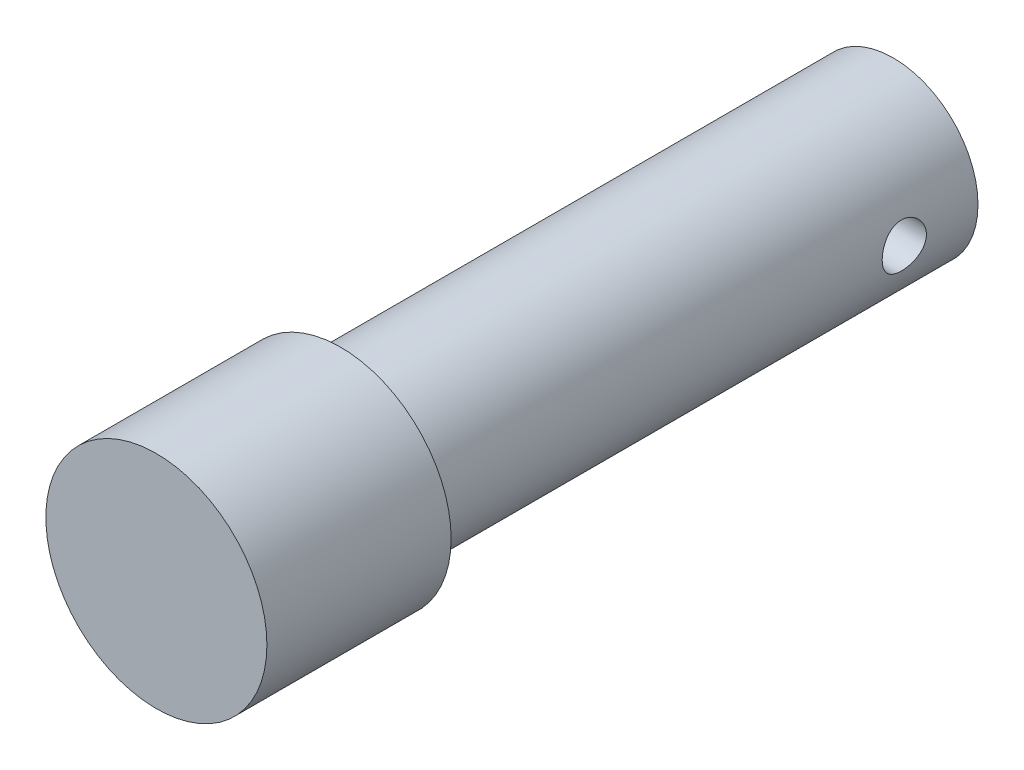
ISO-10303-21;
HEADER;
FILE_DESCRIPTION(('STEP AP214'),'2;1');
FILE_NAME('part.step','',(''),(''),'','','');
FILE_SCHEMA(('AUTOMOTIVE_DESIGN { 1 0 10303 214 1 1 1 1 }'));
ENDSEC;
DATA;
#1=APPLICATION_CONTEXT('core data for automotive mechanical design processes');
#2=APPLICATION_PROTOCOL_DEFINITION('international standard','automotive_design',2000,#1);
#3=PRODUCT_CONTEXT('',#1,'mechanical');
#4=PRODUCT('Part','Part','',(#3));
#5=PRODUCT_RELATED_PRODUCT_CATEGORY('part','',(#4));
#6=PRODUCT_DEFINITION_FORMATION('','',#4);
#7=PRODUCT_DEFINITION_CONTEXT('part definition',#1,'design');
#8=PRODUCT_DEFINITION('design','',#6,#7);
#9=PRODUCT_DEFINITION_SHAPE('','',#8);
#10=(LENGTH_UNIT() NAMED_UNIT(*) SI_UNIT(.MILLI.,.METRE.));
#11=(NAMED_UNIT(*) PLANE_ANGLE_UNIT() SI_UNIT($,.RADIAN.));
#12=(NAMED_UNIT(*) SI_UNIT($,.STERADIAN.) SOLID_ANGLE_UNIT());
#13=UNCERTAINTY_MEASURE_WITH_UNIT(LENGTH_MEASURE(1.E-05),#10,'distance_accuracy_value','');
#14=(GEOMETRIC_REPRESENTATION_CONTEXT(3) GLOBAL_UNCERTAINTY_ASSIGNED_CONTEXT((#13)) GLOBAL_UNIT_ASSIGNED_CONTEXT((#10,
#11,#12)) REPRESENTATION_CONTEXT('',''));
#15=CARTESIAN_POINT('',(0.,0.,0.));
#16=DIRECTION('',(0.,0.,1.));
#17=DIRECTION('',(1.,0.,0.));
#18=AXIS2_PLACEMENT_3D('',#15,#16,#17);
#19=CARTESIAN_POINT('',(0.,0.,20.));
#20=DIRECTION('',(0.,0.,-1.));
#21=DIRECTION('',(-1.,0.,0.));
#22=AXIS2_PLACEMENT_3D('',#19,#20,#21);
#23=CYLINDRICAL_SURFACE('',#22,2.3);
#24=CARTESIAN_POINT('',(0.,0.,0.));
#25=DIRECTION('',(0.,0.,1.));
#26=DIRECTION('',(1.,0.,0.));
#27=AXIS2_PLACEMENT_3D('',#24,#25,#26);
#28=CIRCLE('',#27,2.3);
#29=CARTESIAN_POINT('',(2.3,0.,0.));
#30=VERTEX_POINT('',#29);
#31=EDGE_CURVE('E49',#30,#30,#28,.T.);
#32=ORIENTED_EDGE('',*,*,#31,.T.);
#33=EDGE_LOOP('',(#32));
#34=FACE_BOUND('',#33,.T.);
#35=CARTESIAN_POINT('',(0.,0.,15.));
#36=DIRECTION('',(0.,0.,1.));
#37=DIRECTION('',(1.,0.,0.));
#38=AXIS2_PLACEMENT_3D('',#35,#36,#37);
#39=CIRCLE('',#38,2.3);
#40=CARTESIAN_POINT('',(2.3,0.,15.));
#41=VERTEX_POINT('',#40);
#42=EDGE_CURVE('E10',#41,#41,#39,.T.);
#43=ORIENTED_EDGE('',*,*,#42,.F.);
#44=EDGE_LOOP('',(#43));
#45=FACE_BOUND('',#44,.T.);
#46=CARTESIAN_POINT('',(2.3,0.,2.6));
#47=CARTESIAN_POINT('',(2.29999947684165,-0.0331026201720601,2.59999916122626));
#48=CARTESIAN_POINT('',(2.29927829471571,-0.066214358533514,2.59725134537636));
#49=CARTESIAN_POINT('',(2.2964713380731,-0.131485704025533,2.58635107363675));
#50=CARTESIAN_POINT('',(2.29438486559341,-0.163644815360249,2.57819585334815));
#51=CARTESIAN_POINT('',(2.28907788721465,-0.226059166658215,2.55676265163744));
#52=CARTESIAN_POINT('',(2.28585880855801,-0.256316746519614,2.54349111548509));
#53=CARTESIAN_POINT('',(2.27862774791672,-0.314176440073206,2.51222547721423));
#54=CARTESIAN_POINT('',(2.2746157222172,-0.341778407237713,2.49423111471018));
#55=CARTESIAN_POINT('',(2.26613286933225,-0.39415809747041,2.45360742121448));
#56=CARTESIAN_POINT('',(2.26165446733598,-0.418868247566317,2.43089254145927));
#57=CARTESIAN_POINT('',(2.25279283584502,-0.46417509639839,2.38165558187005));
#58=CARTESIAN_POINT('',(2.24840961811166,-0.484771289346703,2.35513303459287));
#59=CARTESIAN_POINT('',(2.24015755667313,-0.521590896798203,2.29849946095544));
#60=CARTESIAN_POINT('',(2.23629829132483,-0.537737336567531,2.26833686706777));
#61=CARTESIAN_POINT('',(2.22964214928102,-0.564703583563824,2.20560829622142));
#62=CARTESIAN_POINT('',(2.22684508603313,-0.575524326231022,2.17304274249066));
#63=CARTESIAN_POINT('',(2.22270812406389,-0.591298811010342,2.10717916922616));
#64=CARTESIAN_POINT('',(2.22133793709545,-0.596374710584678,2.07391235471923));
#65=CARTESIAN_POINT('',(2.22011931222218,-0.600896147949937,2.00697331429409));
#66=CARTESIAN_POINT('',(2.22027060314634,-0.600342689053825,1.97330116168723));
#67=CARTESIAN_POINT('',(2.22205069020862,-0.593718271860884,1.90745458044621));
#68=CARTESIAN_POINT('',(2.22364011723389,-0.587794322889984,1.87526412962448));
#69=CARTESIAN_POINT('',(2.2280544558132,-0.570832204709706,1.81235058009942));
#70=CARTESIAN_POINT('',(2.23087946231683,-0.559793642457791,1.78162759436651));
#71=CARTESIAN_POINT('',(2.23748180654148,-0.53279391514654,1.72213399753535));
#72=CARTESIAN_POINT('',(2.24126915750179,-0.516780570942413,1.69338822474524));
#73=CARTESIAN_POINT('',(2.24936397370178,-0.480322272755023,1.63893976052689));
#74=CARTESIAN_POINT('',(2.25367153725764,-0.459876480490787,1.61323764615029));
#75=CARTESIAN_POINT('',(2.26248597108159,-0.414378511833336,1.56476525263782));
#76=CARTESIAN_POINT('',(2.26699486963393,-0.3892026665794,1.54211126536548));
#77=CARTESIAN_POINT('',(2.27558334924829,-0.335354526076545,1.50132359071));
#78=CARTESIAN_POINT('',(2.2796629147963,-0.306682104559134,1.48319006664202));
#79=CARTESIAN_POINT('',(2.286956411327,-0.246479657757733,1.45190990024031));
#80=CARTESIAN_POINT('',(2.29016680725488,-0.214938639626481,1.43878353695278));
#81=CARTESIAN_POINT('',(2.29533464035765,-0.149994881443205,1.41805264038695));
#82=CARTESIAN_POINT('',(2.2972923391683,-0.116592531730387,1.41044695402681));
#83=CARTESIAN_POINT('',(2.29969493194014,-0.0498673792580725,1.40115412899243));
#84=CARTESIAN_POINT('',(2.30018025148354,-0.0165680313638617,1.39930879224148));
#85=CARTESIAN_POINT('',(2.2996992439209,0.049864094400171,1.40115322493814));
#86=CARTESIAN_POINT('',(2.29873305993852,0.0829968883696245,1.40484244865736));
#87=CARTESIAN_POINT('',(2.29548364712719,0.147596039594424,1.41752128184156));
#88=CARTESIAN_POINT('',(2.29322218658484,0.179080775702191,1.42642333896928));
#89=CARTESIAN_POINT('',(2.2876381257928,0.240107486091453,1.44917406354045));
#90=CARTESIAN_POINT('',(2.28431541317481,0.269649254246517,1.46302325481851));
#91=CARTESIAN_POINT('',(2.27688193839581,0.326571377446485,1.49557320183726));
#92=CARTESIAN_POINT('',(2.27275743576476,0.353900164567712,1.51436092226612));
#93=CARTESIAN_POINT('',(2.26419747965347,0.405072889012884,1.55614464306144));
#94=CARTESIAN_POINT('',(2.25976196759522,0.428916167225036,1.57914143751947));
#95=CARTESIAN_POINT('',(2.25093229305464,0.473102511979112,1.62942753114285));
#96=CARTESIAN_POINT('',(2.2465424519825,0.493334177695149,1.6568156527985));
#97=CARTESIAN_POINT('',(2.23843300372096,0.528915871073281,1.71469024395768));
#98=CARTESIAN_POINT('',(2.23471336773749,0.544266108478275,1.74517658026428));
#99=CARTESIAN_POINT('',(2.22840773153593,0.56953371453138,1.80822516768533));
#100=CARTESIAN_POINT('',(2.22581510340788,0.579482935009394,1.84077395543321));
#101=CARTESIAN_POINT('',(2.22205367899179,0.593744791977813,1.90716117012334));
#102=CARTESIAN_POINT('',(2.22088453776952,0.59805879399254,1.9409992825907));
#103=CARTESIAN_POINT('',(2.22013039156686,0.600851718858099,2.00786658829012));
#104=CARTESIAN_POINT('',(2.22049687425826,0.599509326810864,2.04088788539811));
#105=CARTESIAN_POINT('',(2.22265960321909,0.59144009311178,2.10621574878536));
#106=CARTESIAN_POINT('',(2.22445581564822,0.584713378901494,2.13852233196258));
#107=CARTESIAN_POINT('',(2.22924738161656,0.566167957266263,2.20128967329054));
#108=CARTESIAN_POINT('',(2.23223417077999,0.554385572338902,2.23176186279928));
#109=CARTESIAN_POINT('',(2.23907089968641,0.526091622016803,2.29031957969488));
#110=CARTESIAN_POINT('',(2.24292096939028,0.509579344465599,2.31840474685329));
#111=CARTESIAN_POINT('',(2.25118632977299,0.471746195739657,2.37224785933324));
#112=CARTESIAN_POINT('',(2.25561451551962,0.450302657712929,2.39791764498861));
#113=CARTESIAN_POINT('',(2.26446343132724,0.403451026864356,2.44535256447895));
#114=CARTESIAN_POINT('',(2.26888415933467,0.37804198001122,2.46711675598116));
#115=CARTESIAN_POINT('',(2.2773267993239,0.323361032572895,2.50655375535764));
#116=CARTESIAN_POINT('',(2.28133884850868,0.294021456106721,2.52413501183459));
#117=CARTESIAN_POINT('',(2.28840561777423,0.232700024005632,2.55408782424253));
#118=CARTESIAN_POINT('',(2.29146097748803,0.200719951934603,2.5664628629089));
#119=CARTESIAN_POINT('',(2.29585479861646,0.14069671111774,2.58395831743215));
#120=CARTESIAN_POINT('',(2.29739815464227,0.112922258691986,2.5899603256226));
#121=CARTESIAN_POINT('',(2.29947093407654,0.0567674028404812,2.59798134752378));
#122=CARTESIAN_POINT('',(2.30000044863289,0.0283870541189154,2.60000071928794));
#123=CARTESIAN_POINT('',(2.3,0.,2.6));
#124=B_SPLINE_CURVE_WITH_KNOTS('',3,(#46,#47,#48,#49,#50,#51,#52,#53,#54,#55,#56,#57,#58,#59,
#60,#61,#62,#63,#64,#65,#66,#67,#68,#69,#70,#71,#72,#73,#74,#75,#76,#77,#78,#79,#80,#81,#82,#83,
#84,#85,#86,#87,#88,#89,#90,#91,#92,#93,#94,#95,#96,#97,#98,#99,#100,#101,#102,#103,#104,#105,
#106,#107,#108,#109,#110,#111,#112,#113,#114,#115,#116,#117,#118,#119,#120,#121,#122,#123),
.UNSPECIFIED.,.T.,.F.,(4,2,2,2,2,2,2,2,2,2,2,2,2,2,2,2,2,2,2,2,2,2,2,2,2,2,2,2,2,2,2,2,2,2,2,2,
2,2,4),(0.,0.0992037845275571,0.198458323625531,0.297588233437714,0.396723609768457,
0.497842887278411,0.598974589192112,0.701759272967622,0.804525896521012,0.905063647101407,
1.00558347928818,1.10343216166619,1.20128836466646,1.30020773661004,1.39914583289709,
1.50116641519128,1.60319068274809,1.70562387005234,1.8080356563828,1.9076089581507,
2.00717244226351,2.1051098115654,2.20305755418601,2.30286142511077,2.40268414466035,
2.50519192626009,2.60769530275871,2.70958742335936,2.81145484891117,2.91012881729046,
3.00880045022387,3.1067747434739,3.20476379598796,3.30552108756782,3.40630265704412,
3.5091205167838,3.61186948601507,3.69694904762455,3.78202095992477),.UNSPECIFIED.);
#125=CARTESIAN_POINT('',(2.3,0.,2.6));
#126=VERTEX_POINT('',#125);
#127=EDGE_CURVE('E58',#126,#126,#124,.T.);
#128=ORIENTED_EDGE('',*,*,#127,.F.);
#129=EDGE_LOOP('',(#128));
#130=FACE_BOUND('',#129,.T.);
#131=CARTESIAN_POINT('',(-2.3,0.,2.6));
#132=CARTESIAN_POINT('',(-2.29999947684165,0.0331026201720599,2.59999916122626));
#133=CARTESIAN_POINT('',(-2.29927829471571,0.0662143585335139,2.59725134537636));
#134=CARTESIAN_POINT('',(-2.2964713380731,0.131485704025533,2.58635107363675));
#135=CARTESIAN_POINT('',(-2.29438486559341,0.163644815360249,2.57819585334815));
#136=CARTESIAN_POINT('',(-2.28907788721465,0.226059166658214,2.55676265163744));
#137=CARTESIAN_POINT('',(-2.28585880855801,0.256316746519614,2.54349111548509));
#138=CARTESIAN_POINT('',(-2.27862774791672,0.314176440073206,2.51222547721423));
#139=CARTESIAN_POINT('',(-2.2746157222172,0.341778407237712,2.49423111471018));
#140=CARTESIAN_POINT('',(-2.26613286933224,0.394158097470409,2.45360742121448));
#141=CARTESIAN_POINT('',(-2.26165446733598,0.418868247566317,2.43089254145927));
#142=CARTESIAN_POINT('',(-2.25279283584502,0.46417509639839,2.38165558187005));
#143=CARTESIAN_POINT('',(-2.24840961811166,0.484771289346703,2.35513303459287));
#144=CARTESIAN_POINT('',(-2.24015755667313,0.521590896798202,2.29849946095543));
#145=CARTESIAN_POINT('',(-2.23629829132483,0.537737336567531,2.26833686706777));
#146=CARTESIAN_POINT('',(-2.22964214928102,0.564703583563824,2.20560829622142));
#147=CARTESIAN_POINT('',(-2.22684508603313,0.575524326231022,2.17304274249066));
#148=CARTESIAN_POINT('',(-2.22270812406389,0.591298811010341,2.10717916922616));
#149=CARTESIAN_POINT('',(-2.22133793709545,0.596374710584678,2.07391235471923));
#150=CARTESIAN_POINT('',(-2.22011931222218,0.600896147949937,2.00697331429409));
#151=CARTESIAN_POINT('',(-2.22027060314634,0.600342689053824,1.97330116168723));
#152=CARTESIAN_POINT('',(-2.22205069020862,0.593718271860884,1.90745458044621));
#153=CARTESIAN_POINT('',(-2.22364011723389,0.587794322889984,1.87526412962448));
#154=CARTESIAN_POINT('',(-2.2280544558132,0.570832204709705,1.81235058009942));
#155=CARTESIAN_POINT('',(-2.23087946231683,0.55979364245779,1.78162759436651));
#156=CARTESIAN_POINT('',(-2.23748180654148,0.532793915146539,1.72213399753535));
#157=CARTESIAN_POINT('',(-2.24126915750179,0.516780570942412,1.69338822474524));
#158=CARTESIAN_POINT('',(-2.24936397370178,0.480322272755022,1.63893976052689));
#159=CARTESIAN_POINT('',(-2.25367153725764,0.459876480490787,1.61323764615029));
#160=CARTESIAN_POINT('',(-2.26248597108159,0.414378511833336,1.56476525263782));
#161=CARTESIAN_POINT('',(-2.26699486963393,0.389202666579399,1.54211126536548));
#162=CARTESIAN_POINT('',(-2.27558334924829,0.335354526076544,1.50132359071));
#163=CARTESIAN_POINT('',(-2.2796629147963,0.306682104559133,1.48319006664202));
#164=CARTESIAN_POINT('',(-2.286956411327,0.246479657757733,1.45190990024031));
#165=CARTESIAN_POINT('',(-2.29016680725488,0.21493863962648,1.43878353695278));
#166=CARTESIAN_POINT('',(-2.29533464035765,0.149994881443204,1.41805264038695));
#167=CARTESIAN_POINT('',(-2.2972923391683,0.116592531730386,1.41044695402681));
#168=CARTESIAN_POINT('',(-2.29969493194014,0.0498673792580715,1.40115412899243));
#169=CARTESIAN_POINT('',(-2.30018025148354,0.0165680313638606,1.39930879224148));
#170=CARTESIAN_POINT('',(-2.2996992439209,-0.049864094400172,1.40115322493814));
#171=CARTESIAN_POINT('',(-2.29873305993852,-0.0829968883696255,1.40484244865736));
#172=CARTESIAN_POINT('',(-2.29548364712719,-0.147596039594425,1.41752128184156));
#173=CARTESIAN_POINT('',(-2.29322218658484,-0.179080775702192,1.42642333896928));
#174=CARTESIAN_POINT('',(-2.2876381257928,-0.240107486091454,1.44917406354045));
#175=CARTESIAN_POINT('',(-2.28431541317481,-0.269649254246518,1.46302325481851));
#176=CARTESIAN_POINT('',(-2.27688193839581,-0.326571377446486,1.49557320183726));
#177=CARTESIAN_POINT('',(-2.27275743576476,-0.353900164567713,1.51436092226612));
#178=CARTESIAN_POINT('',(-2.26419747965347,-0.405072889012885,1.55614464306144));
#179=CARTESIAN_POINT('',(-2.25976196759522,-0.428916167225037,1.57914143751947));
#180=CARTESIAN_POINT('',(-2.25093229305464,-0.473102511979113,1.62942753114285));
#181=CARTESIAN_POINT('',(-2.2465424519825,-0.49333417769515,1.6568156527985));
#182=CARTESIAN_POINT('',(-2.23843300372096,-0.528915871073282,1.71469024395768));
#183=CARTESIAN_POINT('',(-2.23471336773749,-0.544266108478276,1.74517658026428));
#184=CARTESIAN_POINT('',(-2.22840773153593,-0.569533714531381,1.80822516768533));
#185=CARTESIAN_POINT('',(-2.22581510340788,-0.579482935009394,1.84077395543321));
#186=CARTESIAN_POINT('',(-2.22205367899179,-0.593744791977814,1.90716117012335));
#187=CARTESIAN_POINT('',(-2.22088453776952,-0.59805879399254,1.9409992825907));
#188=CARTESIAN_POINT('',(-2.22013039156686,-0.6008517188581,2.00786658829012));
#189=CARTESIAN_POINT('',(-2.22049687425826,-0.599509326810865,2.04088788539811));
#190=CARTESIAN_POINT('',(-2.22265960321909,-0.59144009311178,2.10621574878536));
#191=CARTESIAN_POINT('',(-2.22445581564822,-0.584713378901494,2.13852233196258));
#192=CARTESIAN_POINT('',(-2.22924738161656,-0.566167957266263,2.20128967329054));
#193=CARTESIAN_POINT('',(-2.23223417077999,-0.554385572338903,2.23176186279928));
#194=CARTESIAN_POINT('',(-2.23907089968641,-0.526091622016803,2.29031957969488));
#195=CARTESIAN_POINT('',(-2.24292096939028,-0.509579344465599,2.31840474685329));
#196=CARTESIAN_POINT('',(-2.25118632977299,-0.471746195739657,2.37224785933325));
#197=CARTESIAN_POINT('',(-2.25561451551962,-0.450302657712929,2.39791764498861));
#198=CARTESIAN_POINT('',(-2.26446343132724,-0.403451026864356,2.44535256447895));
#199=CARTESIAN_POINT('',(-2.26888415933467,-0.37804198001122,2.46711675598116));
#200=CARTESIAN_POINT('',(-2.2773267993239,-0.323361032572894,2.50655375535764));
#201=CARTESIAN_POINT('',(-2.28133884850868,-0.294021456106721,2.52413501183459));
#202=CARTESIAN_POINT('',(-2.28840561777423,-0.232700024005632,2.55408782424253));
#203=CARTESIAN_POINT('',(-2.29146097748803,-0.200719951934604,2.5664628629089));
#204=CARTESIAN_POINT('',(-2.29585479861646,-0.140696711117741,2.58395831743215));
#205=CARTESIAN_POINT('',(-2.29739815464227,-0.112922258691986,2.5899603256226));
#206=CARTESIAN_POINT('',(-2.29947093407654,-0.0567674028404814,2.59798134752378));
#207=CARTESIAN_POINT('',(-2.30000044863289,-0.0283870541189156,2.60000071928794));
#208=CARTESIAN_POINT('',(-2.3,0.,2.6));
#209=B_SPLINE_CURVE_WITH_KNOTS('',3,(#131,#132,#133,#134,#135,#136,#137,#138,#139,#140,#141,
#142,#143,#144,#145,#146,#147,#148,#149,#150,#151,#152,#153,#154,#155,#156,#157,#158,#159,#160,
#161,#162,#163,#164,#165,#166,#167,#168,#169,#170,#171,#172,#173,#174,#175,#176,#177,#178,#179,
#180,#181,#182,#183,#184,#185,#186,#187,#188,#189,#190,#191,#192,#193,#194,#195,#196,#197,#198,
#199,#200,#201,#202,#203,#204,#205,#206,#207,#208),.UNSPECIFIED.,.T.,.F.,(4,2,2,2,2,2,2,2,2,2,2,
2,2,2,2,2,2,2,2,2,2,2,2,2,2,2,2,2,2,2,2,2,2,2,2,2,2,2,4),(0.,0.0992037845275572,
0.198458323625531,0.297588233437713,0.396723609768456,0.49784288727841,0.598974589192112,
0.701759272967622,0.804525896521012,0.905063647101407,1.00558347928818,1.10343216166619,
1.20128836466646,1.30020773661004,1.39914583289709,1.50116641519128,1.60319068274809,
1.70562387005234,1.8080356563828,1.9076089581507,2.00717244226351,2.1051098115654,
2.20305755418601,2.30286142511077,2.40268414466036,2.50519192626009,2.60769530275871,
2.70958742335936,2.81145484891117,2.91012881729046,3.00880045022387,3.1067747434739,
3.20476379598797,3.30552108756782,3.40630265704412,3.5091205167838,3.61186948601507,
3.69694904762455,3.78202095992477),.UNSPECIFIED.);
#210=CARTESIAN_POINT('',(-2.3,0.,2.6));
#211=VERTEX_POINT('',#210);
#212=EDGE_CURVE('E40',#211,#211,#209,.T.);
#213=ORIENTED_EDGE('',*,*,#212,.F.);
#214=EDGE_LOOP('',(#213));
#215=FACE_BOUND('',#214,.T.);
#216=ADVANCED_FACE('F36',(#34,#45,#130,#215),#23,.T.);
#217=CARTESIAN_POINT('',(0.,0.,0.));
#218=DIRECTION('',(0.,0.,1.));
#219=DIRECTION('',(1.,0.,0.));
#220=AXIS2_PLACEMENT_3D('',#217,#218,#219);
#221=PLANE('',#220);
#222=ORIENTED_EDGE('',*,*,#31,.F.);
#223=EDGE_LOOP('',(#222));
#224=FACE_BOUND('',#223,.T.);
#225=ADVANCED_FACE('F77',(#224),#221,.F.);
#226=CARTESIAN_POINT('',(0.,0.,15.));
#227=DIRECTION('',(0.,0.,1.));
#228=DIRECTION('',(1.,0.,0.));
#229=AXIS2_PLACEMENT_3D('',#226,#227,#228);
#230=CYLINDRICAL_SURFACE('',#229,3.);
#231=CARTESIAN_POINT('',(0.,0.,15.));
#232=DIRECTION('',(0.,0.,1.));
#233=DIRECTION('',(1.,0.,0.));
#234=AXIS2_PLACEMENT_3D('',#231,#232,#233);
#235=CIRCLE('',#234,3.);
#236=CARTESIAN_POINT('',(3.,0.,15.));
#237=VERTEX_POINT('',#236);
#238=EDGE_CURVE('E55',#237,#237,#235,.T.);
#239=ORIENTED_EDGE('',*,*,#238,.T.);
#240=EDGE_LOOP('',(#239));
#241=FACE_BOUND('',#240,.T.);
#242=CARTESIAN_POINT('',(0.,0.,20.));
#243=DIRECTION('',(0.,0.,1.));
#244=DIRECTION('',(1.,0.,0.));
#245=AXIS2_PLACEMENT_3D('',#242,#243,#244);
#246=CIRCLE('',#245,3.);
#247=CARTESIAN_POINT('',(3.,0.,20.));
#248=VERTEX_POINT('',#247);
#249=EDGE_CURVE('E96',#248,#248,#246,.T.);
#250=ORIENTED_EDGE('',*,*,#249,.F.);
#251=EDGE_LOOP('',(#250));
#252=FACE_BOUND('',#251,.T.);
#253=ADVANCED_FACE('F74',(#241,#252),#230,.T.);
#254=CARTESIAN_POINT('',(0.,0.,15.));
#255=DIRECTION('',(0.,0.,1.));
#256=DIRECTION('',(1.,0.,0.));
#257=AXIS2_PLACEMENT_3D('',#254,#255,#256);
#258=PLANE('',#257);
#259=ORIENTED_EDGE('',*,*,#42,.T.);
#260=EDGE_LOOP('',(#259));
#261=FACE_BOUND('',#260,.T.);
#262=ORIENTED_EDGE('',*,*,#238,.F.);
#263=EDGE_LOOP('',(#262));
#264=FACE_BOUND('',#263,.T.);
#265=ADVANCED_FACE('F70',(#261,#264),#258,.F.);
#266=CARTESIAN_POINT('',(0.,0.,20.));
#267=DIRECTION('',(0.,0.,1.));
#268=DIRECTION('',(1.,0.,0.));
#269=AXIS2_PLACEMENT_3D('',#266,#267,#268);
#270=PLANE('',#269);
#271=ORIENTED_EDGE('',*,*,#249,.T.);
#272=EDGE_LOOP('',(#271));
#273=FACE_BOUND('',#272,.T.);
#274=ADVANCED_FACE('F68',(#273),#270,.T.);
#275=CARTESIAN_POINT('',(5.,0.,2.));
#276=DIRECTION('',(-1.,0.,0.));
#277=DIRECTION('',(0.,0.,1.));
#278=AXIS2_PLACEMENT_3D('',#275,#276,#277);
#279=CYLINDRICAL_SURFACE('',#278,0.6);
#280=ORIENTED_EDGE('',*,*,#127,.T.);
#281=EDGE_LOOP('',(#280));
#282=FACE_BOUND('',#281,.T.);
#283=ORIENTED_EDGE('',*,*,#212,.T.);
#284=EDGE_LOOP('',(#283));
#285=FACE_BOUND('',#284,.T.);
#286=ADVANCED_FACE('F64',(#282,#285),#279,.F.);
#287=CLOSED_SHELL('',(#216,#225,#253,#265,#274,#286));
#288=MANIFOLD_SOLID_BREP('B2',#287);
#289=ADVANCED_BREP_SHAPE_REPRESENTATION('',(#18,#288),#14);
#290=SHAPE_DEFINITION_REPRESENTATION(#9,#289);
ENDSEC;
END-ISO-10303-21;
